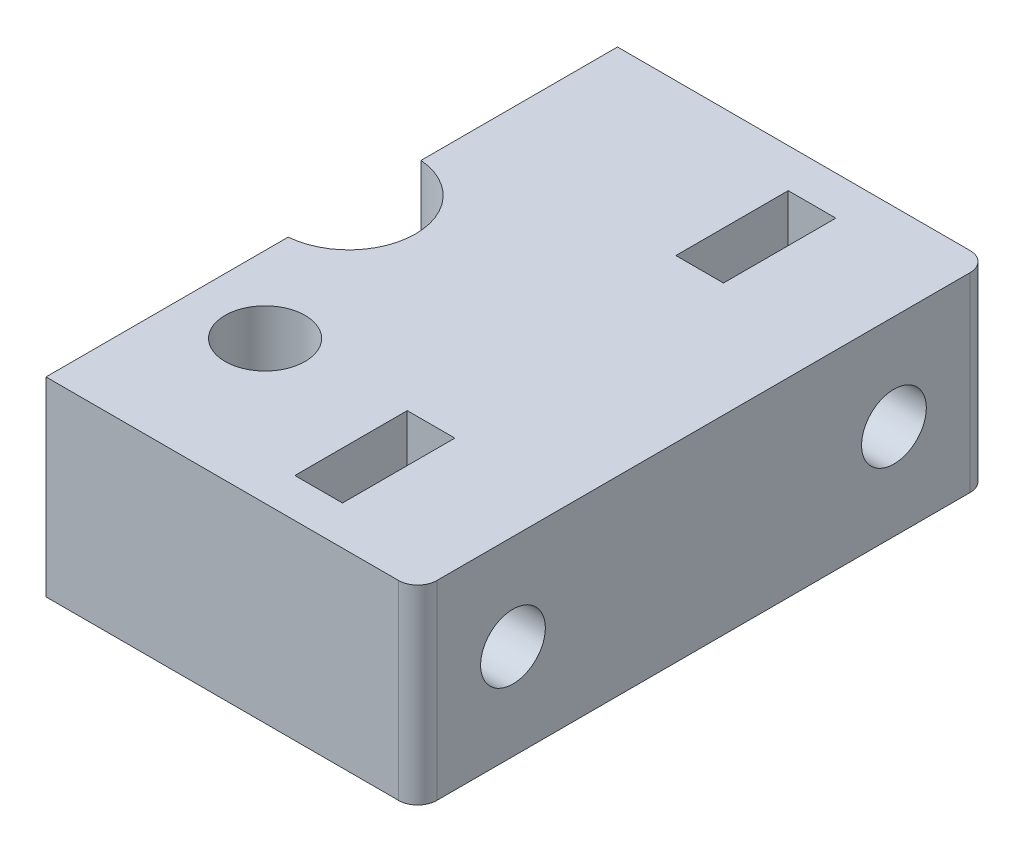
ISO-10303-21;
HEADER;
FILE_DESCRIPTION(('STEP AP214'),'2;1');
FILE_NAME('part.step','',(''),(''),'','','');
FILE_SCHEMA(('AUTOMOTIVE_DESIGN { 1 0 10303 214 1 1 1 1 }'));
ENDSEC;
DATA;
#1=APPLICATION_CONTEXT('core data for automotive mechanical design processes');
#2=APPLICATION_PROTOCOL_DEFINITION('international standard','automotive_design',2000,#1);
#3=PRODUCT_CONTEXT('',#1,'mechanical');
#4=PRODUCT('Part','Part','',(#3));
#5=PRODUCT_RELATED_PRODUCT_CATEGORY('part','',(#4));
#6=PRODUCT_DEFINITION_FORMATION('','',#4);
#7=PRODUCT_DEFINITION_CONTEXT('part definition',#1,'design');
#8=PRODUCT_DEFINITION('design','',#6,#7);
#9=PRODUCT_DEFINITION_SHAPE('','',#8);
#10=(LENGTH_UNIT() NAMED_UNIT(*) SI_UNIT(.MILLI.,.METRE.));
#11=(NAMED_UNIT(*) PLANE_ANGLE_UNIT() SI_UNIT($,.RADIAN.));
#12=(NAMED_UNIT(*) SI_UNIT($,.STERADIAN.) SOLID_ANGLE_UNIT());
#13=UNCERTAINTY_MEASURE_WITH_UNIT(LENGTH_MEASURE(1.E-05),#10,'distance_accuracy_value','');
#14=(GEOMETRIC_REPRESENTATION_CONTEXT(3) GLOBAL_UNCERTAINTY_ASSIGNED_CONTEXT((#13)) GLOBAL_UNIT_ASSIGNED_CONTEXT((#10,
#11,#12)) REPRESENTATION_CONTEXT('',''));
#15=CARTESIAN_POINT('',(0.,0.,0.));
#16=DIRECTION('',(0.,0.,1.));
#17=DIRECTION('',(1.,0.,0.));
#18=AXIS2_PLACEMENT_3D('',#15,#16,#17);
#19=CARTESIAN_POINT('',(0.,10.,0.));
#20=DIRECTION('',(0.,-1.,0.));
#21=DIRECTION('',(0.,0.,-1.));
#22=AXIS2_PLACEMENT_3D('',#19,#20,#21);
#23=PLANE('',#22);
#24=DIRECTION('',(-1.,0.,0.));
#25=VECTOR('',#24,1.);
#26=CARTESIAN_POINT('',(-29.5136,10.,-15.));
#27=LINE('',#26,#25);
#28=CARTESIAN_POINT('',(28.5136,10.,-15.));
#29=VERTEX_POINT('',#28);
#30=CARTESIAN_POINT('',(10.,10.,-15.));
#31=VERTEX_POINT('',#30);
#32=EDGE_CURVE('E181',#29,#31,#27,.T.);
#33=ORIENTED_EDGE('',*,*,#32,.T.);
#34=DIRECTION('',(0.,0.,-1.));
#35=VECTOR('',#34,1.);
#36=CARTESIAN_POINT('',(10.,10.,15.));
#37=LINE('',#36,#35);
#38=CARTESIAN_POINT('',(10.,10.,-4.68711915483254));
#39=VERTEX_POINT('',#38);
#40=EDGE_CURVE('E230',#39,#31,#37,.T.);
#41=ORIENTED_EDGE('',*,*,#40,.F.);
#42=CARTESIAN_POINT('',(9.69999999999999,10.,-1.2));
#43=DIRECTION('',(0.,1.,0.));
#44=DIRECTION('',(0.,0.,1.));
#45=AXIS2_PLACEMENT_3D('',#42,#43,#44);
#46=CIRCLE('',#45,3.5);
#47=CARTESIAN_POINT('',(10.,10.,2.28711915483254));
#48=VERTEX_POINT('',#47);
#49=EDGE_CURVE('E224',#48,#39,#46,.T.);
#50=ORIENTED_EDGE('',*,*,#49,.F.);
#51=CARTESIAN_POINT('',(10.,10.,15.));
#52=VERTEX_POINT('',#51);
#53=EDGE_CURVE('E47',#52,#48,#37,.T.);
#54=ORIENTED_EDGE('',*,*,#53,.F.);
#55=DIRECTION('',(1.,0.,0.));
#56=VECTOR('',#55,1.);
#57=CARTESIAN_POINT('',(-29.5136,10.,15.));
#58=LINE('',#57,#56);
#59=CARTESIAN_POINT('',(28.5136,10.,15.));
#60=VERTEX_POINT('',#59);
#61=EDGE_CURVE('E169',#52,#60,#58,.T.);
#62=ORIENTED_EDGE('',*,*,#61,.T.);
#63=CARTESIAN_POINT('',(28.5136,10.,14.));
#64=DIRECTION('',(0.,-1.,0.));
#65=DIRECTION('',(0.,0.,-1.));
#66=AXIS2_PLACEMENT_3D('',#63,#64,#65);
#67=CIRCLE('',#66,1.);
#68=CARTESIAN_POINT('',(29.5136,10.,14.));
#69=VERTEX_POINT('',#68);
#70=EDGE_CURVE('E215',#60,#69,#67,.F.);
#71=ORIENTED_EDGE('',*,*,#70,.T.);
#72=DIRECTION('',(0.,0.,-1.));
#73=VECTOR('',#72,1.);
#74=CARTESIAN_POINT('',(29.5136,10.,15.));
#75=LINE('',#74,#73);
#76=CARTESIAN_POINT('',(29.5136,10.,-14.));
#77=VERTEX_POINT('',#76);
#78=EDGE_CURVE('E177',#69,#77,#75,.T.);
#79=ORIENTED_EDGE('',*,*,#78,.T.);
#80=CARTESIAN_POINT('',(28.5136,10.,-14.));
#81=DIRECTION('',(0.,-1.,0.));
#82=DIRECTION('',(0.,0.,-1.));
#83=AXIS2_PLACEMENT_3D('',#80,#81,#82);
#84=CIRCLE('',#83,1.);
#85=EDGE_CURVE('E217',#77,#29,#84,.F.);
#86=ORIENTED_EDGE('',*,*,#85,.T.);
#87=EDGE_LOOP('',(#33,#41,#50,#54,#62,#71,#79,#86));
#88=FACE_BOUND('',#87,.T.);
#89=DIRECTION('',(0.,0.,1.));
#90=VECTOR('',#89,1.);
#91=CARTESIAN_POINT('',(21.0136,10.,12.95));
#92=LINE('',#91,#90);
#93=CARTESIAN_POINT('',(21.0136,10.,7.05));
#94=VERTEX_POINT('',#93);
#95=CARTESIAN_POINT('',(21.0136,10.,12.95));
#96=VERTEX_POINT('',#95);
#97=EDGE_CURVE('E277',#94,#96,#92,.T.);
#98=ORIENTED_EDGE('',*,*,#97,.F.);
#99=DIRECTION('',(1.,0.,0.));
#100=VECTOR('',#99,1.);
#101=CARTESIAN_POINT('',(21.0136,10.,7.05));
#102=LINE('',#101,#100);
#103=CARTESIAN_POINT('',(23.5136,10.,7.05));
#104=VERTEX_POINT('',#103);
#105=EDGE_CURVE('E289',#94,#104,#102,.T.);
#106=ORIENTED_EDGE('',*,*,#105,.T.);
#107=DIRECTION('',(0.,0.,1.));
#108=VECTOR('',#107,1.);
#109=CARTESIAN_POINT('',(23.5136,10.,12.95));
#110=LINE('',#109,#108);
#111=CARTESIAN_POINT('',(23.5136,10.,12.95));
#112=VERTEX_POINT('',#111);
#113=EDGE_CURVE('E203',#104,#112,#110,.T.);
#114=ORIENTED_EDGE('',*,*,#113,.T.);
#115=DIRECTION('',(1.,0.,0.));
#116=VECTOR('',#115,1.);
#117=CARTESIAN_POINT('',(21.0136,10.,12.95));
#118=LINE('',#117,#116);
#119=EDGE_CURVE('E307',#96,#112,#118,.T.);
#120=ORIENTED_EDGE('',*,*,#119,.F.);
#121=EDGE_LOOP('',(#98,#106,#114,#120));
#122=FACE_BOUND('',#121,.T.);
#123=CARTESIAN_POINT('',(14.,10.,7.5));
#124=DIRECTION('',(0.,1.,0.));
#125=DIRECTION('',(0.,0.,1.));
#126=AXIS2_PLACEMENT_3D('',#123,#124,#125);
#127=CIRCLE('',#126,2.1);
#128=CARTESIAN_POINT('',(14.,10.,9.6));
#129=VERTEX_POINT('',#128);
#130=EDGE_CURVE('E320',#129,#129,#127,.T.);
#131=ORIENTED_EDGE('',*,*,#130,.F.);
#132=EDGE_LOOP('',(#131));
#133=FACE_BOUND('',#132,.T.);
#134=DIRECTION('',(1.,0.,0.));
#135=VECTOR('',#134,1.);
#136=CARTESIAN_POINT('',(21.0136,10.,-7.05));
#137=LINE('',#136,#135);
#138=CARTESIAN_POINT('',(21.0136,10.,-7.05));
#139=VERTEX_POINT('',#138);
#140=CARTESIAN_POINT('',(23.5136,10.,-7.05));
#141=VERTEX_POINT('',#140);
#142=EDGE_CURVE('E200',#139,#141,#137,.T.);
#143=ORIENTED_EDGE('',*,*,#142,.F.);
#144=DIRECTION('',(0.,0.,1.));
#145=VECTOR('',#144,1.);
#146=CARTESIAN_POINT('',(21.0136,10.,-7.05));
#147=LINE('',#146,#145);
#148=CARTESIAN_POINT('',(21.0136,10.,-12.95));
#149=VERTEX_POINT('',#148);
#150=EDGE_CURVE('E248',#149,#139,#147,.T.);
#151=ORIENTED_EDGE('',*,*,#150,.F.);
#152=DIRECTION('',(1.,0.,0.));
#153=VECTOR('',#152,1.);
#154=CARTESIAN_POINT('',(21.0136,10.,-12.95));
#155=LINE('',#154,#153);
#156=CARTESIAN_POINT('',(23.5136,10.,-12.95));
#157=VERTEX_POINT('',#156);
#158=EDGE_CURVE('E265',#149,#157,#155,.T.);
#159=ORIENTED_EDGE('',*,*,#158,.T.);
#160=DIRECTION('',(0.,0.,1.));
#161=VECTOR('',#160,1.);
#162=CARTESIAN_POINT('',(23.5136,10.,-7.05));
#163=LINE('',#162,#161);
#164=EDGE_CURVE('E240',#157,#141,#163,.T.);
#165=ORIENTED_EDGE('',*,*,#164,.T.);
#166=EDGE_LOOP('',(#143,#151,#159,#165));
#167=FACE_BOUND('',#166,.T.);
#168=ADVANCED_FACE('F32',(#88,#122,#133,#167),#23,.F.);
#169=CARTESIAN_POINT('',(17.5136,5.,-10.));
#170=DIRECTION('',(1.,0.,0.));
#171=DIRECTION('',(0.,0.,-1.));
#172=AXIS2_PLACEMENT_3D('',#169,#170,#171);
#173=CYLINDRICAL_SURFACE('',#172,1.7);
#174=CARTESIAN_POINT('',(29.5136,5.,-10.));
#175=DIRECTION('',(1.,0.,0.));
#176=DIRECTION('',(0.,0.,-1.));
#177=AXIS2_PLACEMENT_3D('',#174,#175,#176);
#178=CIRCLE('',#177,1.7);
#179=CARTESIAN_POINT('',(29.5136,5.,-11.7));
#180=VERTEX_POINT('',#179);
#181=EDGE_CURVE('E195',#180,#180,#178,.T.);
#182=ORIENTED_EDGE('',*,*,#181,.T.);
#183=EDGE_LOOP('',(#182));
#184=FACE_BOUND('',#183,.T.);
#185=CARTESIAN_POINT('',(23.5136,5.,-10.));
#186=DIRECTION('',(-1.,0.,0.));
#187=DIRECTION('',(0.,0.,1.));
#188=AXIS2_PLACEMENT_3D('',#185,#186,#187);
#189=CIRCLE('',#188,1.7);
#190=CARTESIAN_POINT('',(23.5136,5.,-8.3));
#191=VERTEX_POINT('',#190);
#192=EDGE_CURVE('E196',#191,#191,#189,.F.);
#193=ORIENTED_EDGE('',*,*,#192,.F.);
#194=EDGE_LOOP('',(#193));
#195=FACE_BOUND('',#194,.T.);
#196=ADVANCED_FACE('F352',(#184,#195),#173,.F.);
#197=CARTESIAN_POINT('',(29.5136,10.,15.));
#198=DIRECTION('',(-1.,0.,0.));
#199=DIRECTION('',(0.,0.,1.));
#200=AXIS2_PLACEMENT_3D('',#197,#198,#199);
#201=PLANE('',#200);
#202=ORIENTED_EDGE('',*,*,#181,.F.);
#203=EDGE_LOOP('',(#202));
#204=FACE_BOUND('',#203,.T.);
#205=CARTESIAN_POINT('',(29.5136,5.,10.));
#206=DIRECTION('',(1.,0.,0.));
#207=DIRECTION('',(0.,0.,-1.));
#208=AXIS2_PLACEMENT_3D('',#205,#206,#207);
#209=CIRCLE('',#208,1.7);
#210=CARTESIAN_POINT('',(29.5136,5.,8.3));
#211=VERTEX_POINT('',#210);
#212=EDGE_CURVE('E314',#211,#211,#209,.T.);
#213=ORIENTED_EDGE('',*,*,#212,.F.);
#214=EDGE_LOOP('',(#213));
#215=FACE_BOUND('',#214,.T.);
#216=DIRECTION('',(0.,0.,-1.));
#217=VECTOR('',#216,1.);
#218=CARTESIAN_POINT('',(29.5136,0.,15.));
#219=LINE('',#218,#217);
#220=CARTESIAN_POINT('',(29.5136,0.,14.));
#221=VERTEX_POINT('',#220);
#222=CARTESIAN_POINT('',(29.5136,0.,-14.));
#223=VERTEX_POINT('',#222);
#224=EDGE_CURVE('E184',#221,#223,#219,.T.);
#225=ORIENTED_EDGE('',*,*,#224,.T.);
#226=DIRECTION('',(0.,-1.,0.));
#227=VECTOR('',#226,1.);
#228=CARTESIAN_POINT('',(29.5136,10.,-14.));
#229=LINE('',#228,#227);
#230=EDGE_CURVE('E213',#223,#77,#229,.F.);
#231=ORIENTED_EDGE('',*,*,#230,.T.);
#232=ORIENTED_EDGE('',*,*,#78,.F.);
#233=DIRECTION('',(0.,-1.,0.));
#234=VECTOR('',#233,1.);
#235=CARTESIAN_POINT('',(29.5136,10.,14.));
#236=LINE('',#235,#234);
#237=EDGE_CURVE('E210',#69,#221,#236,.T.);
#238=ORIENTED_EDGE('',*,*,#237,.T.);
#239=EDGE_LOOP('',(#225,#231,#232,#238));
#240=FACE_BOUND('',#239,.T.);
#241=ADVANCED_FACE('F332',(#204,#215,#240),#201,.F.);
#242=CARTESIAN_POINT('',(-29.5136,10.,-15.));
#243=DIRECTION('',(0.,0.,1.));
#244=DIRECTION('',(1.,0.,0.));
#245=AXIS2_PLACEMENT_3D('',#242,#243,#244);
#246=PLANE('',#245);
#247=DIRECTION('',(-1.,0.,0.));
#248=VECTOR('',#247,1.);
#249=CARTESIAN_POINT('',(-29.5136,0.,-15.));
#250=LINE('',#249,#248);
#251=CARTESIAN_POINT('',(28.5136,0.,-15.));
#252=VERTEX_POINT('',#251);
#253=CARTESIAN_POINT('',(10.,0.,-15.));
#254=VERTEX_POINT('',#253);
#255=EDGE_CURVE('E178',#252,#254,#250,.T.);
#256=ORIENTED_EDGE('',*,*,#255,.T.);
#257=DIRECTION('',(0.,1.,0.));
#258=VECTOR('',#257,1.);
#259=CARTESIAN_POINT('',(10.,0.,-15.));
#260=LINE('',#259,#258);
#261=EDGE_CURVE('E170',#254,#31,#260,.T.);
#262=ORIENTED_EDGE('',*,*,#261,.T.);
#263=ORIENTED_EDGE('',*,*,#32,.F.);
#264=DIRECTION('',(0.,-1.,0.));
#265=VECTOR('',#264,1.);
#266=CARTESIAN_POINT('',(28.5136,10.,-15.));
#267=LINE('',#266,#265);
#268=EDGE_CURVE('E204',#29,#252,#267,.T.);
#269=ORIENTED_EDGE('',*,*,#268,.T.);
#270=EDGE_LOOP('',(#256,#262,#263,#269));
#271=FACE_BOUND('',#270,.T.);
#272=ADVANCED_FACE('F341',(#271),#246,.F.);
#273=CARTESIAN_POINT('',(-29.5136,10.,15.));
#274=DIRECTION('',(0.,0.,-1.));
#275=DIRECTION('',(-1.,0.,0.));
#276=AXIS2_PLACEMENT_3D('',#273,#274,#275);
#277=PLANE('',#276);
#278=ORIENTED_EDGE('',*,*,#61,.F.);
#279=DIRECTION('',(0.,1.,0.));
#280=VECTOR('',#279,1.);
#281=CARTESIAN_POINT('',(10.,0.,15.));
#282=LINE('',#281,#280);
#283=CARTESIAN_POINT('',(10.,0.,15.));
#284=VERTEX_POINT('',#283);
#285=EDGE_CURVE('E157',#284,#52,#282,.T.);
#286=ORIENTED_EDGE('',*,*,#285,.F.);
#287=DIRECTION('',(1.,0.,0.));
#288=VECTOR('',#287,1.);
#289=CARTESIAN_POINT('',(-29.5136,0.,15.));
#290=LINE('',#289,#288);
#291=CARTESIAN_POINT('',(28.5136,0.,15.));
#292=VERTEX_POINT('',#291);
#293=EDGE_CURVE('E167',#284,#292,#290,.T.);
#294=ORIENTED_EDGE('',*,*,#293,.T.);
#295=DIRECTION('',(0.,-1.,0.));
#296=VECTOR('',#295,1.);
#297=CARTESIAN_POINT('',(28.5136,10.,15.));
#298=LINE('',#297,#296);
#299=EDGE_CURVE('E219',#292,#60,#298,.F.);
#300=ORIENTED_EDGE('',*,*,#299,.T.);
#301=EDGE_LOOP('',(#278,#286,#294,#300));
#302=FACE_BOUND('',#301,.T.);
#303=ADVANCED_FACE('F165',(#302),#277,.F.);
#304=CARTESIAN_POINT('',(0.,0.,0.));
#305=DIRECTION('',(0.,-1.,0.));
#306=DIRECTION('',(0.,0.,-1.));
#307=AXIS2_PLACEMENT_3D('',#304,#305,#306);
#308=PLANE('',#307);
#309=DIRECTION('',(0.,0.,-1.));
#310=VECTOR('',#309,1.);
#311=CARTESIAN_POINT('',(10.,0.,15.));
#312=LINE('',#311,#310);
#313=CARTESIAN_POINT('',(10.,0.,-4.68711915483254));
#314=VERTEX_POINT('',#313);
#315=EDGE_CURVE('E55',#314,#254,#312,.T.);
#316=ORIENTED_EDGE('',*,*,#315,.T.);
#317=ORIENTED_EDGE('',*,*,#255,.F.);
#318=CARTESIAN_POINT('',(28.5136,0.,-14.));
#319=DIRECTION('',(0.,-1.,0.));
#320=DIRECTION('',(0.,0.,-1.));
#321=AXIS2_PLACEMENT_3D('',#318,#319,#320);
#322=CIRCLE('',#321,1.);
#323=EDGE_CURVE('E208',#252,#223,#322,.T.);
#324=ORIENTED_EDGE('',*,*,#323,.T.);
#325=ORIENTED_EDGE('',*,*,#224,.F.);
#326=CARTESIAN_POINT('',(28.5136,0.,14.));
#327=DIRECTION('',(0.,-1.,0.));
#328=DIRECTION('',(0.,0.,-1.));
#329=AXIS2_PLACEMENT_3D('',#326,#327,#328);
#330=CIRCLE('',#329,1.);
#331=EDGE_CURVE('E175',#221,#292,#330,.T.);
#332=ORIENTED_EDGE('',*,*,#331,.T.);
#333=ORIENTED_EDGE('',*,*,#293,.F.);
#334=CARTESIAN_POINT('',(10.,0.,2.28711915483254));
#335=VERTEX_POINT('',#334);
#336=EDGE_CURVE('E154',#284,#335,#312,.T.);
#337=ORIENTED_EDGE('',*,*,#336,.T.);
#338=CARTESIAN_POINT('',(9.69999999999999,0.,-1.2));
#339=DIRECTION('',(0.,1.,0.));
#340=DIRECTION('',(0.,0.,1.));
#341=AXIS2_PLACEMENT_3D('',#338,#339,#340);
#342=CIRCLE('',#341,3.5);
#343=EDGE_CURVE('E225',#335,#314,#342,.T.);
#344=ORIENTED_EDGE('',*,*,#343,.T.);
#345=EDGE_LOOP('',(#316,#317,#324,#325,#332,#333,#337,#344));
#346=FACE_BOUND('',#345,.T.);
#347=CARTESIAN_POINT('',(14.,0.,7.5));
#348=DIRECTION('',(0.,1.,0.));
#349=DIRECTION('',(0.,0.,1.));
#350=AXIS2_PLACEMENT_3D('',#347,#348,#349);
#351=CIRCLE('',#350,2.1);
#352=CARTESIAN_POINT('',(14.,0.,9.6));
#353=VERTEX_POINT('',#352);
#354=EDGE_CURVE('E323',#353,#353,#351,.T.);
#355=ORIENTED_EDGE('',*,*,#354,.T.);
#356=EDGE_LOOP('',(#355));
#357=FACE_BOUND('',#356,.T.);
#358=ADVANCED_FACE('F172',(#346,#357),#308,.T.);
#359=CARTESIAN_POINT('',(14.,0.,7.5));
#360=DIRECTION('',(0.,1.,0.));
#361=DIRECTION('',(0.,0.,1.));
#362=AXIS2_PLACEMENT_3D('',#359,#360,#361);
#363=CYLINDRICAL_SURFACE('',#362,2.1);
#364=ORIENTED_EDGE('',*,*,#354,.F.);
#365=EDGE_LOOP('',(#364));
#366=FACE_BOUND('',#365,.T.);
#367=ORIENTED_EDGE('',*,*,#130,.T.);
#368=EDGE_LOOP('',(#367));
#369=FACE_BOUND('',#368,.T.);
#370=ADVANCED_FACE('F362',(#366,#369),#363,.F.);
#371=CARTESIAN_POINT('',(17.5136,5.,10.));
#372=DIRECTION('',(1.,0.,0.));
#373=DIRECTION('',(0.,0.,-1.));
#374=AXIS2_PLACEMENT_3D('',#371,#372,#373);
#375=CYLINDRICAL_SURFACE('',#374,1.7);
#376=CARTESIAN_POINT('',(23.5136,5.,10.));
#377=DIRECTION('',(1.,0.,0.));
#378=DIRECTION('',(0.,0.,-1.));
#379=AXIS2_PLACEMENT_3D('',#376,#377,#378);
#380=CIRCLE('',#379,1.7);
#381=CARTESIAN_POINT('',(23.5136,5.,8.3));
#382=VERTEX_POINT('',#381);
#383=EDGE_CURVE('E188',#382,#382,#380,.F.);
#384=ORIENTED_EDGE('',*,*,#383,.T.);
#385=EDGE_LOOP('',(#384));
#386=FACE_BOUND('',#385,.T.);
#387=ORIENTED_EDGE('',*,*,#212,.T.);
#388=EDGE_LOOP('',(#387));
#389=FACE_BOUND('',#388,.T.);
#390=ADVANCED_FACE('F413',(#386,#389),#375,.F.);
#391=CARTESIAN_POINT('',(21.0136,0.,0.));
#392=DIRECTION('',(1.,0.,0.));
#393=DIRECTION('',(0.,0.,-1.));
#394=AXIS2_PLACEMENT_3D('',#391,#392,#393);
#395=PLANE('',#394);
#396=DIRECTION('',(0.,1.,0.));
#397=VECTOR('',#396,1.);
#398=CARTESIAN_POINT('',(21.0136,10.,7.05));
#399=LINE('',#398,#397);
#400=CARTESIAN_POINT('',(21.0136,3.2968167058906,7.05));
#401=VERTEX_POINT('',#400);
#402=EDGE_CURVE('E274',#401,#94,#399,.T.);
#403=ORIENTED_EDGE('',*,*,#402,.T.);
#404=ORIENTED_EDGE('',*,*,#97,.T.);
#405=DIRECTION('',(0.,-1.,0.));
#406=VECTOR('',#405,1.);
#407=CARTESIAN_POINT('',(21.0136,6.70318329410939,12.95));
#408=LINE('',#407,#406);
#409=CARTESIAN_POINT('',(21.0136,3.2968167058906,12.95));
#410=VERTEX_POINT('',#409);
#411=EDGE_CURVE('E281',#96,#410,#408,.T.);
#412=ORIENTED_EDGE('',*,*,#411,.T.);
#413=DIRECTION('',(0.,-0.5,-0.866025403784439));
#414=VECTOR('',#413,1.);
#415=CARTESIAN_POINT('',(21.0136,3.2968167058906,12.95));
#416=LINE('',#415,#414);
#417=CARTESIAN_POINT('',(21.0136,1.5936334117812,10.));
#418=VERTEX_POINT('',#417);
#419=EDGE_CURVE('E283',#410,#418,#416,.T.);
#420=ORIENTED_EDGE('',*,*,#419,.T.);
#421=DIRECTION('',(0.,0.5,-0.866025403784439));
#422=VECTOR('',#421,1.);
#423=CARTESIAN_POINT('',(21.0136,1.5936334117812,10.));
#424=LINE('',#423,#422);
#425=EDGE_CURVE('E286',#418,#401,#424,.T.);
#426=ORIENTED_EDGE('',*,*,#425,.T.);
#427=EDGE_LOOP('',(#403,#404,#412,#420,#426));
#428=FACE_BOUND('',#427,.T.);
#429=CARTESIAN_POINT('',(21.0136,5.,10.));
#430=DIRECTION('',(1.,0.,0.));
#431=DIRECTION('',(0.,0.,-1.));
#432=AXIS2_PLACEMENT_3D('',#429,#430,#431);
#433=CIRCLE('',#432,1.7);
#434=CARTESIAN_POINT('',(21.0136,5.,8.3));
#435=VERTEX_POINT('',#434);
#436=EDGE_CURVE('E191',#435,#435,#433,.F.);
#437=ORIENTED_EDGE('',*,*,#436,.T.);
#438=EDGE_LOOP('',(#437));
#439=FACE_BOUND('',#438,.T.);
#440=ADVANCED_FACE('F409',(#428,#439),#395,.T.);
#441=CARTESIAN_POINT('',(23.5136,0.,0.));
#442=DIRECTION('',(1.,0.,0.));
#443=DIRECTION('',(0.,0.,-1.));
#444=AXIS2_PLACEMENT_3D('',#441,#442,#443);
#445=PLANE('',#444);
#446=DIRECTION('',(0.,1.,0.));
#447=VECTOR('',#446,1.);
#448=CARTESIAN_POINT('',(23.5136,3.2968167058906,7.05));
#449=LINE('',#448,#447);
#450=CARTESIAN_POINT('',(23.5136,3.2968167058906,7.05));
#451=VERTEX_POINT('',#450);
#452=EDGE_CURVE('E278',#451,#104,#449,.T.);
#453=ORIENTED_EDGE('',*,*,#452,.F.);
#454=DIRECTION('',(0.,0.5,-0.866025403784439));
#455=VECTOR('',#454,1.);
#456=CARTESIAN_POINT('',(23.5136,1.5936334117812,10.));
#457=LINE('',#456,#455);
#458=CARTESIAN_POINT('',(23.5136,1.5936334117812,10.));
#459=VERTEX_POINT('',#458);
#460=EDGE_CURVE('E298',#459,#451,#457,.T.);
#461=ORIENTED_EDGE('',*,*,#460,.F.);
#462=DIRECTION('',(0.,-0.5,-0.866025403784439));
#463=VECTOR('',#462,1.);
#464=CARTESIAN_POINT('',(23.5136,3.2968167058906,12.95));
#465=LINE('',#464,#463);
#466=CARTESIAN_POINT('',(23.5136,3.2968167058906,12.95));
#467=VERTEX_POINT('',#466);
#468=EDGE_CURVE('E295',#467,#459,#465,.T.);
#469=ORIENTED_EDGE('',*,*,#468,.F.);
#470=DIRECTION('',(0.,-1.,0.));
#471=VECTOR('',#470,1.);
#472=CARTESIAN_POINT('',(23.5136,6.70318329410939,12.95));
#473=LINE('',#472,#471);
#474=EDGE_CURVE('E292',#112,#467,#473,.T.);
#475=ORIENTED_EDGE('',*,*,#474,.F.);
#476=ORIENTED_EDGE('',*,*,#113,.F.);
#477=EDGE_LOOP('',(#453,#461,#469,#475,#476));
#478=FACE_BOUND('',#477,.T.);
#479=ORIENTED_EDGE('',*,*,#383,.F.);
#480=EDGE_LOOP('',(#479));
#481=FACE_BOUND('',#480,.T.);
#482=ADVANCED_FACE('F412',(#478,#481),#445,.F.);
#483=CARTESIAN_POINT('',(21.0136,3.2968167058906,7.05));
#484=DIRECTION('',(0.,0.,-1.));
#485=DIRECTION('',(-1.,0.,0.));
#486=AXIS2_PLACEMENT_3D('',#483,#484,#485);
#487=PLANE('',#486);
#488=ORIENTED_EDGE('',*,*,#452,.T.);
#489=ORIENTED_EDGE('',*,*,#105,.F.);
#490=ORIENTED_EDGE('',*,*,#402,.F.);
#491=DIRECTION('',(1.,0.,0.));
#492=VECTOR('',#491,1.);
#493=CARTESIAN_POINT('',(21.0136,3.2968167058906,7.05));
#494=LINE('',#493,#492);
#495=EDGE_CURVE('E192',#401,#451,#494,.T.);
#496=ORIENTED_EDGE('',*,*,#495,.T.);
#497=EDGE_LOOP('',(#488,#489,#490,#496));
#498=FACE_BOUND('',#497,.T.);
#499=ADVANCED_FACE('F417',(#498),#487,.F.);
#500=CARTESIAN_POINT('',(21.0136,1.5936334117812,10.));
#501=DIRECTION('',(0.,-0.866025403784439,-0.5));
#502=DIRECTION('',(0.,0.5,-0.866025403784439));
#503=AXIS2_PLACEMENT_3D('',#500,#501,#502);
#504=PLANE('',#503);
#505=ORIENTED_EDGE('',*,*,#460,.T.);
#506=ORIENTED_EDGE('',*,*,#495,.F.);
#507=ORIENTED_EDGE('',*,*,#425,.F.);
#508=DIRECTION('',(1.,0.,0.));
#509=VECTOR('',#508,1.);
#510=CARTESIAN_POINT('',(21.0136,1.5936334117812,10.));
#511=LINE('',#510,#509);
#512=EDGE_CURVE('E303',#418,#459,#511,.T.);
#513=ORIENTED_EDGE('',*,*,#512,.T.);
#514=EDGE_LOOP('',(#505,#506,#507,#513));
#515=FACE_BOUND('',#514,.T.);
#516=ADVANCED_FACE('F421',(#515),#504,.F.);
#517=CARTESIAN_POINT('',(21.0136,3.2968167058906,12.95));
#518=DIRECTION('',(0.,-0.866025403784439,0.5));
#519=DIRECTION('',(0.,-0.5,-0.866025403784439));
#520=AXIS2_PLACEMENT_3D('',#517,#518,#519);
#521=PLANE('',#520);
#522=ORIENTED_EDGE('',*,*,#468,.T.);
#523=ORIENTED_EDGE('',*,*,#512,.F.);
#524=ORIENTED_EDGE('',*,*,#419,.F.);
#525=DIRECTION('',(1.,0.,0.));
#526=VECTOR('',#525,1.);
#527=CARTESIAN_POINT('',(21.0136,3.2968167058906,12.95));
#528=LINE('',#527,#526);
#529=EDGE_CURVE('E305',#410,#467,#528,.T.);
#530=ORIENTED_EDGE('',*,*,#529,.T.);
#531=EDGE_LOOP('',(#522,#523,#524,#530));
#532=FACE_BOUND('',#531,.T.);
#533=ADVANCED_FACE('F425',(#532),#521,.F.);
#534=CARTESIAN_POINT('',(21.0136,6.70318329410939,12.95));
#535=DIRECTION('',(0.,0.,1.));
#536=DIRECTION('',(1.,0.,0.));
#537=AXIS2_PLACEMENT_3D('',#534,#535,#536);
#538=PLANE('',#537);
#539=ORIENTED_EDGE('',*,*,#474,.T.);
#540=ORIENTED_EDGE('',*,*,#529,.F.);
#541=ORIENTED_EDGE('',*,*,#411,.F.);
#542=ORIENTED_EDGE('',*,*,#119,.T.);
#543=EDGE_LOOP('',(#539,#540,#541,#542));
#544=FACE_BOUND('',#543,.T.);
#545=ADVANCED_FACE('F429',(#544),#538,.F.);
#546=CARTESIAN_POINT('',(17.5136,5.,10.));
#547=DIRECTION('',(1.,0.,0.));
#548=DIRECTION('',(0.,0.,-1.));
#549=AXIS2_PLACEMENT_3D('',#546,#547,#548);
#550=PLANE('',#549);
#551=CARTESIAN_POINT('',(17.5136,5.,10.));
#552=DIRECTION('',(1.,0.,0.));
#553=DIRECTION('',(0.,0.,-1.));
#554=AXIS2_PLACEMENT_3D('',#551,#552,#553);
#555=CIRCLE('',#554,1.7);
#556=CARTESIAN_POINT('',(17.5136,5.,8.3));
#557=VERTEX_POINT('',#556);
#558=EDGE_CURVE('E317',#557,#557,#555,.T.);
#559=ORIENTED_EDGE('',*,*,#558,.T.);
#560=EDGE_LOOP('',(#559));
#561=FACE_BOUND('',#560,.T.);
#562=ADVANCED_FACE('F433',(#561),#550,.T.);
#563=ORIENTED_EDGE('',*,*,#558,.F.);
#564=EDGE_LOOP('',(#563));
#565=FACE_BOUND('',#564,.T.);
#566=ORIENTED_EDGE('',*,*,#436,.F.);
#567=EDGE_LOOP('',(#566));
#568=FACE_BOUND('',#567,.T.);
#569=ADVANCED_FACE('F388',(#565,#568),#375,.F.);
#570=CARTESIAN_POINT('',(21.0136,0.,0.));
#571=DIRECTION('',(-1.,0.,0.));
#572=DIRECTION('',(0.,0.,1.));
#573=AXIS2_PLACEMENT_3D('',#570,#571,#572);
#574=PLANE('',#573);
#575=DIRECTION('',(0.,-1.,0.));
#576=VECTOR('',#575,1.);
#577=CARTESIAN_POINT('',(21.0136,6.7031832941094,-7.05));
#578=LINE('',#577,#576);
#579=CARTESIAN_POINT('',(21.0136,3.2968167058906,-7.05));
#580=VERTEX_POINT('',#579);
#581=EDGE_CURVE('E237',#139,#580,#578,.T.);
#582=ORIENTED_EDGE('',*,*,#581,.T.);
#583=DIRECTION('',(0.,-0.5,-0.866025403784439));
#584=VECTOR('',#583,1.);
#585=CARTESIAN_POINT('',(21.0136,3.2968167058906,-7.05));
#586=LINE('',#585,#584);
#587=CARTESIAN_POINT('',(21.0136,1.59363341178121,-10.));
#588=VERTEX_POINT('',#587);
#589=EDGE_CURVE('E239',#580,#588,#586,.T.);
#590=ORIENTED_EDGE('',*,*,#589,.T.);
#591=DIRECTION('',(0.,0.5,-0.866025403784438));
#592=VECTOR('',#591,1.);
#593=CARTESIAN_POINT('',(21.0136,1.59363341178121,-10.));
#594=LINE('',#593,#592);
#595=CARTESIAN_POINT('',(21.0136,3.29681670589061,-12.95));
#596=VERTEX_POINT('',#595);
#597=EDGE_CURVE('E243',#588,#596,#594,.T.);
#598=ORIENTED_EDGE('',*,*,#597,.T.);
#599=DIRECTION('',(0.,1.,0.));
#600=VECTOR('',#599,1.);
#601=CARTESIAN_POINT('',(21.0136,3.29681670589061,-12.95));
#602=LINE('',#601,#600);
#603=EDGE_CURVE('E246',#596,#149,#602,.T.);
#604=ORIENTED_EDGE('',*,*,#603,.T.);
#605=ORIENTED_EDGE('',*,*,#150,.T.);
#606=EDGE_LOOP('',(#582,#590,#598,#604,#605));
#607=FACE_BOUND('',#606,.T.);
#608=CARTESIAN_POINT('',(21.0136,5.,-10.));
#609=DIRECTION('',(-1.,0.,0.));
#610=DIRECTION('',(0.,0.,1.));
#611=AXIS2_PLACEMENT_3D('',#608,#609,#610);
#612=CIRCLE('',#611,1.7);
#613=CARTESIAN_POINT('',(21.0136,5.,-8.3));
#614=VERTEX_POINT('',#613);
#615=EDGE_CURVE('E199',#614,#614,#612,.F.);
#616=ORIENTED_EDGE('',*,*,#615,.F.);
#617=EDGE_LOOP('',(#616));
#618=FACE_BOUND('',#617,.T.);
#619=ADVANCED_FACE('F384',(#607,#618),#574,.F.);
#620=CARTESIAN_POINT('',(23.5136,0.,0.));
#621=DIRECTION('',(-1.,0.,0.));
#622=DIRECTION('',(0.,0.,1.));
#623=AXIS2_PLACEMENT_3D('',#620,#621,#622);
#624=PLANE('',#623);
#625=ORIENTED_EDGE('',*,*,#164,.F.);
#626=DIRECTION('',(0.,1.,0.));
#627=VECTOR('',#626,1.);
#628=CARTESIAN_POINT('',(23.5136,10.,-12.95));
#629=LINE('',#628,#627);
#630=CARTESIAN_POINT('',(23.5136,3.29681670589061,-12.95));
#631=VERTEX_POINT('',#630);
#632=EDGE_CURVE('E260',#631,#157,#629,.T.);
#633=ORIENTED_EDGE('',*,*,#632,.F.);
#634=DIRECTION('',(0.,0.5,-0.866025403784438));
#635=VECTOR('',#634,1.);
#636=CARTESIAN_POINT('',(23.5136,1.59363341178121,-10.));
#637=LINE('',#636,#635);
#638=CARTESIAN_POINT('',(23.5136,1.59363341178121,-10.));
#639=VERTEX_POINT('',#638);
#640=EDGE_CURVE('E257',#639,#631,#637,.T.);
#641=ORIENTED_EDGE('',*,*,#640,.F.);
#642=DIRECTION('',(0.,-0.5,-0.866025403784439));
#643=VECTOR('',#642,1.);
#644=CARTESIAN_POINT('',(23.5136,3.2968167058906,-7.05));
#645=LINE('',#644,#643);
#646=CARTESIAN_POINT('',(23.5136,3.2968167058906,-7.05));
#647=VERTEX_POINT('',#646);
#648=EDGE_CURVE('E254',#647,#639,#645,.T.);
#649=ORIENTED_EDGE('',*,*,#648,.F.);
#650=DIRECTION('',(0.,-1.,0.));
#651=VECTOR('',#650,1.);
#652=CARTESIAN_POINT('',(23.5136,6.7031832941094,-7.05));
#653=LINE('',#652,#651);
#654=EDGE_CURVE('E232',#141,#647,#653,.T.);
#655=ORIENTED_EDGE('',*,*,#654,.F.);
#656=EDGE_LOOP('',(#625,#633,#641,#649,#655));
#657=FACE_BOUND('',#656,.T.);
#658=ORIENTED_EDGE('',*,*,#192,.T.);
#659=EDGE_LOOP('',(#658));
#660=FACE_BOUND('',#659,.T.);
#661=ADVANCED_FACE('F387',(#657,#660),#624,.T.);
#662=CARTESIAN_POINT('',(21.0136,10.,-12.95));
#663=DIRECTION('',(0.,0.,-1.));
#664=DIRECTION('',(-1.,0.,0.));
#665=AXIS2_PLACEMENT_3D('',#662,#663,#664);
#666=PLANE('',#665);
#667=ORIENTED_EDGE('',*,*,#632,.T.);
#668=ORIENTED_EDGE('',*,*,#158,.F.);
#669=ORIENTED_EDGE('',*,*,#603,.F.);
#670=DIRECTION('',(1.,0.,0.));
#671=VECTOR('',#670,1.);
#672=CARTESIAN_POINT('',(21.0136,3.29681670589061,-12.95));
#673=LINE('',#672,#671);
#674=EDGE_CURVE('E268',#596,#631,#673,.T.);
#675=ORIENTED_EDGE('',*,*,#674,.T.);
#676=EDGE_LOOP('',(#667,#668,#669,#675));
#677=FACE_BOUND('',#676,.T.);
#678=ADVANCED_FACE('F392',(#677),#666,.F.);
#679=CARTESIAN_POINT('',(21.0136,1.59363341178121,-10.));
#680=DIRECTION('',(0.,-0.866025403784438,-0.5));
#681=DIRECTION('',(0.,0.5,-0.866025403784439));
#682=AXIS2_PLACEMENT_3D('',#679,#680,#681);
#683=PLANE('',#682);
#684=ORIENTED_EDGE('',*,*,#640,.T.);
#685=ORIENTED_EDGE('',*,*,#674,.F.);
#686=ORIENTED_EDGE('',*,*,#597,.F.);
#687=DIRECTION('',(1.,0.,0.));
#688=VECTOR('',#687,1.);
#689=CARTESIAN_POINT('',(21.0136,1.59363341178121,-10.));
#690=LINE('',#689,#688);
#691=EDGE_CURVE('E271',#588,#639,#690,.T.);
#692=ORIENTED_EDGE('',*,*,#691,.T.);
#693=EDGE_LOOP('',(#684,#685,#686,#692));
#694=FACE_BOUND('',#693,.T.);
#695=ADVANCED_FACE('F396',(#694),#683,.F.);
#696=CARTESIAN_POINT('',(21.0136,3.2968167058906,-7.05));
#697=DIRECTION('',(0.,-0.866025403784439,0.5));
#698=DIRECTION('',(0.,-0.5,-0.866025403784439));
#699=AXIS2_PLACEMENT_3D('',#696,#697,#698);
#700=PLANE('',#699);
#701=ORIENTED_EDGE('',*,*,#648,.T.);
#702=ORIENTED_EDGE('',*,*,#691,.F.);
#703=ORIENTED_EDGE('',*,*,#589,.F.);
#704=DIRECTION('',(1.,0.,0.));
#705=VECTOR('',#704,1.);
#706=CARTESIAN_POINT('',(21.0136,3.2968167058906,-7.05));
#707=LINE('',#706,#705);
#708=EDGE_CURVE('E251',#580,#647,#707,.T.);
#709=ORIENTED_EDGE('',*,*,#708,.T.);
#710=EDGE_LOOP('',(#701,#702,#703,#709));
#711=FACE_BOUND('',#710,.T.);
#712=ADVANCED_FACE('F400',(#711),#700,.F.);
#713=CARTESIAN_POINT('',(21.0136,6.7031832941094,-7.05));
#714=DIRECTION('',(0.,0.,1.));
#715=DIRECTION('',(1.,0.,0.));
#716=AXIS2_PLACEMENT_3D('',#713,#714,#715);
#717=PLANE('',#716);
#718=ORIENTED_EDGE('',*,*,#654,.T.);
#719=ORIENTED_EDGE('',*,*,#708,.F.);
#720=ORIENTED_EDGE('',*,*,#581,.F.);
#721=ORIENTED_EDGE('',*,*,#142,.T.);
#722=EDGE_LOOP('',(#718,#719,#720,#721));
#723=FACE_BOUND('',#722,.T.);
#724=ADVANCED_FACE('F404',(#723),#717,.F.);
#725=CARTESIAN_POINT('',(17.5136,5.,-10.));
#726=DIRECTION('',(1.,0.,0.));
#727=DIRECTION('',(0.,0.,-1.));
#728=AXIS2_PLACEMENT_3D('',#725,#726,#727);
#729=PLANE('',#728);
#730=CARTESIAN_POINT('',(17.5136,5.,-10.));
#731=DIRECTION('',(1.,0.,0.));
#732=DIRECTION('',(0.,0.,-1.));
#733=AXIS2_PLACEMENT_3D('',#730,#731,#732);
#734=CIRCLE('',#733,1.7);
#735=CARTESIAN_POINT('',(17.5136,5.,-11.7));
#736=VERTEX_POINT('',#735);
#737=EDGE_CURVE('E311',#736,#736,#734,.T.);
#738=ORIENTED_EDGE('',*,*,#737,.T.);
#739=EDGE_LOOP('',(#738));
#740=FACE_BOUND('',#739,.T.);
#741=ADVANCED_FACE('F381',(#740),#729,.T.);
#742=ORIENTED_EDGE('',*,*,#615,.T.);
#743=EDGE_LOOP('',(#742));
#744=FACE_BOUND('',#743,.T.);
#745=ORIENTED_EDGE('',*,*,#737,.F.);
#746=EDGE_LOOP('',(#745));
#747=FACE_BOUND('',#746,.T.);
#748=ADVANCED_FACE('F359',(#744,#747),#173,.F.);
#749=CARTESIAN_POINT('',(9.69999999999999,0.,-1.2));
#750=DIRECTION('',(0.,1.,0.));
#751=DIRECTION('',(0.,0.,1.));
#752=AXIS2_PLACEMENT_3D('',#749,#750,#751);
#753=CYLINDRICAL_SURFACE('',#752,3.5);
#754=ORIENTED_EDGE('',*,*,#49,.T.);
#755=DIRECTION('',(0.,1.,0.));
#756=VECTOR('',#755,1.);
#757=CARTESIAN_POINT('',(10.,0.,-4.68711915483254));
#758=LINE('',#757,#756);
#759=EDGE_CURVE('E11',#39,#314,#758,.F.);
#760=ORIENTED_EDGE('',*,*,#759,.T.);
#761=ORIENTED_EDGE('',*,*,#343,.F.);
#762=DIRECTION('',(0.,1.,0.));
#763=VECTOR('',#762,1.);
#764=CARTESIAN_POINT('',(10.,0.,2.28711915483254));
#765=LINE('',#764,#763);
#766=EDGE_CURVE('E40',#335,#48,#765,.T.);
#767=ORIENTED_EDGE('',*,*,#766,.T.);
#768=EDGE_LOOP('',(#754,#760,#761,#767));
#769=FACE_BOUND('',#768,.T.);
#770=ADVANCED_FACE('F223',(#769),#753,.F.);
#771=CARTESIAN_POINT('',(28.5136,10.,-14.));
#772=DIRECTION('',(0.,-1.,0.));
#773=DIRECTION('',(0.,0.,-1.));
#774=AXIS2_PLACEMENT_3D('',#771,#772,#773);
#775=CYLINDRICAL_SURFACE('',#774,1.);
#776=ORIENTED_EDGE('',*,*,#85,.F.);
#777=ORIENTED_EDGE('',*,*,#230,.F.);
#778=ORIENTED_EDGE('',*,*,#323,.F.);
#779=ORIENTED_EDGE('',*,*,#268,.F.);
#780=EDGE_LOOP('',(#776,#777,#778,#779));
#781=FACE_BOUND('',#780,.T.);
#782=ADVANCED_FACE('F337',(#781),#775,.T.);
#783=CARTESIAN_POINT('',(28.5136,10.,14.));
#784=DIRECTION('',(0.,-1.,0.));
#785=DIRECTION('',(0.,0.,-1.));
#786=AXIS2_PLACEMENT_3D('',#783,#784,#785);
#787=CYLINDRICAL_SURFACE('',#786,1.);
#788=ORIENTED_EDGE('',*,*,#70,.F.);
#789=ORIENTED_EDGE('',*,*,#299,.F.);
#790=ORIENTED_EDGE('',*,*,#331,.F.);
#791=ORIENTED_EDGE('',*,*,#237,.F.);
#792=EDGE_LOOP('',(#788,#789,#790,#791));
#793=FACE_BOUND('',#792,.T.);
#794=ADVANCED_FACE('F34',(#793),#787,.T.);
#795=CARTESIAN_POINT('',(10.,0.,15.));
#796=DIRECTION('',(1.,0.,0.));
#797=DIRECTION('',(0.,0.,-1.));
#798=AXIS2_PLACEMENT_3D('',#795,#796,#797);
#799=PLANE('',#798);
#800=ORIENTED_EDGE('',*,*,#336,.F.);
#801=ORIENTED_EDGE('',*,*,#285,.T.);
#802=ORIENTED_EDGE('',*,*,#53,.T.);
#803=ORIENTED_EDGE('',*,*,#766,.F.);
#804=EDGE_LOOP('',(#800,#801,#802,#803));
#805=FACE_BOUND('',#804,.T.);
#806=ADVANCED_FACE('F156',(#805),#799,.F.);
#807=ORIENTED_EDGE('',*,*,#40,.T.);
#808=ORIENTED_EDGE('',*,*,#261,.F.);
#809=ORIENTED_EDGE('',*,*,#315,.F.);
#810=ORIENTED_EDGE('',*,*,#759,.F.);
#811=EDGE_LOOP('',(#807,#808,#809,#810));
#812=FACE_BOUND('',#811,.T.);
#813=ADVANCED_FACE('F343',(#812),#799,.F.);
#814=CLOSED_SHELL('',(#168,#196,#241,#272,#303,#358,#370,#390,#440,#482,#499,#516,#533,#545,
#562,#569,#619,#661,#678,#695,#712,#724,#741,#748,#770,#782,#794,#806,#813));
#815=MANIFOLD_SOLID_BREP('B2',#814);
#816=ADVANCED_BREP_SHAPE_REPRESENTATION('',(#18,#815),#14);
#817=SHAPE_DEFINITION_REPRESENTATION(#9,#816);
ENDSEC;
END-ISO-10303-21;
